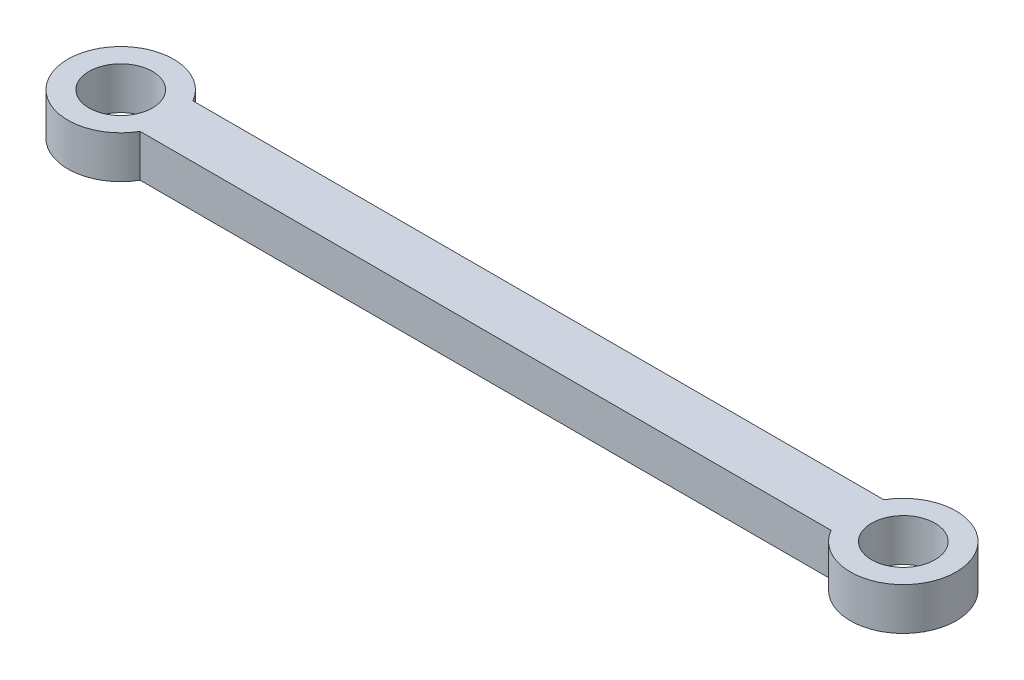
ISO-10303-21;
HEADER;
FILE_DESCRIPTION(('STEP AP214'),'2;1');
FILE_NAME('part.step','',(''),(''),'','','');
FILE_SCHEMA(('AUTOMOTIVE_DESIGN { 1 0 10303 214 1 1 1 1 }'));
ENDSEC;
DATA;
#1=APPLICATION_CONTEXT('core data for automotive mechanical design processes');
#2=APPLICATION_PROTOCOL_DEFINITION('international standard','automotive_design',2000,#1);
#3=PRODUCT_CONTEXT('',#1,'mechanical');
#4=PRODUCT('Part','Part','',(#3));
#5=PRODUCT_RELATED_PRODUCT_CATEGORY('part','',(#4));
#6=PRODUCT_DEFINITION_FORMATION('','',#4);
#7=PRODUCT_DEFINITION_CONTEXT('part definition',#1,'design');
#8=PRODUCT_DEFINITION('design','',#6,#7);
#9=PRODUCT_DEFINITION_SHAPE('','',#8);
#10=(LENGTH_UNIT() NAMED_UNIT(*) SI_UNIT(.MILLI.,.METRE.));
#11=(NAMED_UNIT(*) PLANE_ANGLE_UNIT() SI_UNIT($,.RADIAN.));
#12=(NAMED_UNIT(*) SI_UNIT($,.STERADIAN.) SOLID_ANGLE_UNIT());
#13=UNCERTAINTY_MEASURE_WITH_UNIT(LENGTH_MEASURE(1.E-05),#10,'distance_accuracy_value','');
#14=(GEOMETRIC_REPRESENTATION_CONTEXT(3) GLOBAL_UNCERTAINTY_ASSIGNED_CONTEXT((#13)) GLOBAL_UNIT_ASSIGNED_CONTEXT((#10,
#11,#12)) REPRESENTATION_CONTEXT('',''));
#15=CARTESIAN_POINT('',(0.,0.,0.));
#16=DIRECTION('',(0.,0.,1.));
#17=DIRECTION('',(1.,0.,0.));
#18=AXIS2_PLACEMENT_3D('',#15,#16,#17);
#19=CARTESIAN_POINT('',(-11.7883246029072,2.,-8.43272302998485));
#20=DIRECTION('',(0.,1.,0.));
#21=DIRECTION('',(0.,0.,1.));
#22=AXIS2_PLACEMENT_3D('',#19,#20,#21);
#23=PLANE('',#22);
#24=CARTESIAN_POINT('',(25.2116753970928,2.,-8.43272302998485));
#25=DIRECTION('',(0.,1.,0.));
#26=DIRECTION('',(0.,0.,1.));
#27=AXIS2_PLACEMENT_3D('',#24,#25,#26);
#28=CIRCLE('',#27,1.5);
#29=CARTESIAN_POINT('',(25.2116753970928,2.,-6.93272302998485));
#30=VERTEX_POINT('',#29);
#31=EDGE_CURVE('E103',#30,#30,#28,.T.);
#32=ORIENTED_EDGE('',*,*,#31,.F.);
#33=EDGE_LOOP('',(#32));
#34=FACE_BOUND('',#33,.T.);
#35=CARTESIAN_POINT('',(-11.7883246029072,2.,-8.43272302998485));
#36=DIRECTION('',(0.,1.,0.));
#37=DIRECTION('',(0.,0.,1.));
#38=AXIS2_PLACEMENT_3D('',#35,#36,#37);
#39=CIRCLE('',#38,2.5);
#40=CARTESIAN_POINT('',(-9.62326109344615,2.,-9.68272302998485));
#41=VERTEX_POINT('',#40);
#42=CARTESIAN_POINT('',(-9.62326109344615,2.,-7.18272302998485));
#43=VERTEX_POINT('',#42);
#44=EDGE_CURVE('E88',#41,#43,#39,.T.);
#45=ORIENTED_EDGE('',*,*,#44,.T.);
#46=DIRECTION('',(1.,0.,0.));
#47=VECTOR('',#46,1.);
#48=CARTESIAN_POINT('',(-9.62326109344615,2.,-7.18272302998485));
#49=LINE('',#48,#47);
#50=CARTESIAN_POINT('',(23.0466118876317,2.,-7.18272302998485));
#51=VERTEX_POINT('',#50);
#52=EDGE_CURVE('E83',#43,#51,#49,.T.);
#53=ORIENTED_EDGE('',*,*,#52,.T.);
#54=CARTESIAN_POINT('',(25.2116753970928,2.,-8.43272302998485));
#55=DIRECTION('',(0.,1.,0.));
#56=DIRECTION('',(0.,0.,1.));
#57=AXIS2_PLACEMENT_3D('',#54,#55,#56);
#58=CIRCLE('',#57,2.5);
#59=CARTESIAN_POINT('',(23.0466118876317,2.,-9.68272302998485));
#60=VERTEX_POINT('',#59);
#61=EDGE_CURVE('E86',#51,#60,#58,.T.);
#62=ORIENTED_EDGE('',*,*,#61,.T.);
#63=DIRECTION('',(-1.,0.,0.));
#64=VECTOR('',#63,1.);
#65=CARTESIAN_POINT('',(-9.62326109344615,2.,-9.68272302998485));
#66=LINE('',#65,#64);
#67=EDGE_CURVE('E53',#60,#41,#66,.T.);
#68=ORIENTED_EDGE('',*,*,#67,.T.);
#69=EDGE_LOOP('',(#45,#53,#62,#68));
#70=FACE_BOUND('',#69,.T.);
#71=CARTESIAN_POINT('',(-11.7883246029072,2.,-8.43272302998485));
#72=DIRECTION('',(0.,1.,0.));
#73=DIRECTION('',(0.,0.,1.));
#74=AXIS2_PLACEMENT_3D('',#71,#72,#73);
#75=CIRCLE('',#74,1.5);
#76=CARTESIAN_POINT('',(-11.7883246029072,2.,-6.93272302998485));
#77=VERTEX_POINT('',#76);
#78=EDGE_CURVE('E118',#77,#77,#75,.T.);
#79=ORIENTED_EDGE('',*,*,#78,.F.);
#80=EDGE_LOOP('',(#79));
#81=FACE_BOUND('',#80,.T.);
#82=ADVANCED_FACE('F36',(#34,#70,#81),#23,.T.);
#83=CARTESIAN_POINT('',(-11.7883246029072,0.,-8.43272302998485));
#84=DIRECTION('',(0.,1.,0.));
#85=DIRECTION('',(0.,0.,1.));
#86=AXIS2_PLACEMENT_3D('',#83,#84,#85);
#87=PLANE('',#86);
#88=CARTESIAN_POINT('',(-11.7883246029072,0.,-8.43272302998485));
#89=DIRECTION('',(0.,1.,0.));
#90=DIRECTION('',(0.,0.,1.));
#91=AXIS2_PLACEMENT_3D('',#88,#89,#90);
#92=CIRCLE('',#91,2.5);
#93=CARTESIAN_POINT('',(-9.62326109344615,0.,-9.68272302998485));
#94=VERTEX_POINT('',#93);
#95=CARTESIAN_POINT('',(-9.62326109344615,0.,-7.18272302998485));
#96=VERTEX_POINT('',#95);
#97=EDGE_CURVE('E100',#94,#96,#92,.T.);
#98=ORIENTED_EDGE('',*,*,#97,.F.);
#99=DIRECTION('',(-1.,0.,0.));
#100=VECTOR('',#99,1.);
#101=CARTESIAN_POINT('',(-9.62326109344615,0.,-9.68272302998485));
#102=LINE('',#101,#100);
#103=CARTESIAN_POINT('',(23.0466118876317,0.,-9.68272302998485));
#104=VERTEX_POINT('',#103);
#105=EDGE_CURVE('E76',#104,#94,#102,.T.);
#106=ORIENTED_EDGE('',*,*,#105,.F.);
#107=CARTESIAN_POINT('',(25.2116753970928,0.,-8.43272302998485));
#108=DIRECTION('',(0.,1.,0.));
#109=DIRECTION('',(0.,0.,1.));
#110=AXIS2_PLACEMENT_3D('',#107,#108,#109);
#111=CIRCLE('',#110,2.5);
#112=CARTESIAN_POINT('',(23.0466118876317,0.,-7.18272302998485));
#113=VERTEX_POINT('',#112);
#114=EDGE_CURVE('E70',#113,#104,#111,.T.);
#115=ORIENTED_EDGE('',*,*,#114,.F.);
#116=DIRECTION('',(1.,0.,0.));
#117=VECTOR('',#116,1.);
#118=CARTESIAN_POINT('',(-9.62326109344615,0.,-7.18272302998485));
#119=LINE('',#118,#117);
#120=EDGE_CURVE('E92',#96,#113,#119,.T.);
#121=ORIENTED_EDGE('',*,*,#120,.F.);
#122=EDGE_LOOP('',(#98,#106,#115,#121));
#123=FACE_BOUND('',#122,.T.);
#124=CARTESIAN_POINT('',(25.2116753970928,0.,-8.43272302998485));
#125=DIRECTION('',(0.,1.,0.));
#126=DIRECTION('',(0.,0.,1.));
#127=AXIS2_PLACEMENT_3D('',#124,#125,#126);
#128=CIRCLE('',#127,1.5);
#129=CARTESIAN_POINT('',(25.2116753970928,0.,-6.93272302998485));
#130=VERTEX_POINT('',#129);
#131=EDGE_CURVE('E115',#130,#130,#128,.T.);
#132=ORIENTED_EDGE('',*,*,#131,.T.);
#133=EDGE_LOOP('',(#132));
#134=FACE_BOUND('',#133,.T.);
#135=CARTESIAN_POINT('',(-11.7883246029072,0.,-8.43272302998485));
#136=DIRECTION('',(0.,1.,0.));
#137=DIRECTION('',(0.,0.,1.));
#138=AXIS2_PLACEMENT_3D('',#135,#136,#137);
#139=CIRCLE('',#138,1.5);
#140=CARTESIAN_POINT('',(-11.7883246029072,0.,-6.93272302998485));
#141=VERTEX_POINT('',#140);
#142=EDGE_CURVE('E121',#141,#141,#139,.T.);
#143=ORIENTED_EDGE('',*,*,#142,.T.);
#144=EDGE_LOOP('',(#143));
#145=FACE_BOUND('',#144,.T.);
#146=ADVANCED_FACE('F111',(#123,#134,#145),#87,.F.);
#147=CARTESIAN_POINT('',(-11.7883246029072,2.,-8.43272302998485));
#148=DIRECTION('',(0.,-1.,0.));
#149=DIRECTION('',(0.,0.,-1.));
#150=AXIS2_PLACEMENT_3D('',#147,#148,#149);
#151=CYLINDRICAL_SURFACE('',#150,2.5);
#152=ORIENTED_EDGE('',*,*,#97,.T.);
#153=DIRECTION('',(0.,-1.,0.));
#154=VECTOR('',#153,1.);
#155=CARTESIAN_POINT('',(-9.62326109344615,2.,-7.18272302998485));
#156=LINE('',#155,#154);
#157=EDGE_CURVE('E11',#43,#96,#156,.T.);
#158=ORIENTED_EDGE('',*,*,#157,.F.);
#159=ORIENTED_EDGE('',*,*,#44,.F.);
#160=DIRECTION('',(0.,-1.,0.));
#161=VECTOR('',#160,1.);
#162=CARTESIAN_POINT('',(-9.62326109344615,2.,-9.68272302998485));
#163=LINE('',#162,#161);
#164=EDGE_CURVE('E96',#41,#94,#163,.T.);
#165=ORIENTED_EDGE('',*,*,#164,.T.);
#166=EDGE_LOOP('',(#152,#158,#159,#165));
#167=FACE_BOUND('',#166,.T.);
#168=ADVANCED_FACE('F38',(#167),#151,.T.);
#169=CARTESIAN_POINT('',(-9.62326109344615,2.,-7.18272302998485));
#170=DIRECTION('',(0.,0.,-1.));
#171=DIRECTION('',(-1.,0.,0.));
#172=AXIS2_PLACEMENT_3D('',#169,#170,#171);
#173=PLANE('',#172);
#174=ORIENTED_EDGE('',*,*,#120,.T.);
#175=DIRECTION('',(0.,-1.,0.));
#176=VECTOR('',#175,1.);
#177=CARTESIAN_POINT('',(23.0466118876317,2.,-7.18272302998485));
#178=LINE('',#177,#176);
#179=EDGE_CURVE('E45',#51,#113,#178,.T.);
#180=ORIENTED_EDGE('',*,*,#179,.F.);
#181=ORIENTED_EDGE('',*,*,#52,.F.);
#182=ORIENTED_EDGE('',*,*,#157,.T.);
#183=EDGE_LOOP('',(#174,#180,#181,#182));
#184=FACE_BOUND('',#183,.T.);
#185=ADVANCED_FACE('F91',(#184),#173,.F.);
#186=CARTESIAN_POINT('',(25.2116753970928,2.,-8.43272302998485));
#187=DIRECTION('',(0.,-1.,0.));
#188=DIRECTION('',(0.,0.,-1.));
#189=AXIS2_PLACEMENT_3D('',#186,#187,#188);
#190=CYLINDRICAL_SURFACE('',#189,2.5);
#191=ORIENTED_EDGE('',*,*,#114,.T.);
#192=DIRECTION('',(0.,-1.,0.));
#193=VECTOR('',#192,1.);
#194=CARTESIAN_POINT('',(23.0466118876317,2.,-9.68272302998485));
#195=LINE('',#194,#193);
#196=EDGE_CURVE('E93',#60,#104,#195,.T.);
#197=ORIENTED_EDGE('',*,*,#196,.F.);
#198=ORIENTED_EDGE('',*,*,#61,.F.);
#199=ORIENTED_EDGE('',*,*,#179,.T.);
#200=EDGE_LOOP('',(#191,#197,#198,#199));
#201=FACE_BOUND('',#200,.T.);
#202=ADVANCED_FACE('F94',(#201),#190,.T.);
#203=CARTESIAN_POINT('',(-9.62326109344615,2.,-9.68272302998485));
#204=DIRECTION('',(0.,0.,1.));
#205=DIRECTION('',(1.,0.,0.));
#206=AXIS2_PLACEMENT_3D('',#203,#204,#205);
#207=PLANE('',#206);
#208=ORIENTED_EDGE('',*,*,#105,.T.);
#209=ORIENTED_EDGE('',*,*,#164,.F.);
#210=ORIENTED_EDGE('',*,*,#67,.F.);
#211=ORIENTED_EDGE('',*,*,#196,.T.);
#212=EDGE_LOOP('',(#208,#209,#210,#211));
#213=FACE_BOUND('',#212,.T.);
#214=ADVANCED_FACE('F108',(#213),#207,.F.);
#215=CARTESIAN_POINT('',(25.2116753970928,2.,-8.43272302998485));
#216=DIRECTION('',(0.,-1.,0.));
#217=DIRECTION('',(0.,0.,-1.));
#218=AXIS2_PLACEMENT_3D('',#215,#216,#217);
#219=CYLINDRICAL_SURFACE('',#218,1.5);
#220=ORIENTED_EDGE('',*,*,#31,.T.);
#221=EDGE_LOOP('',(#220));
#222=FACE_BOUND('',#221,.T.);
#223=ORIENTED_EDGE('',*,*,#131,.F.);
#224=EDGE_LOOP('',(#223));
#225=FACE_BOUND('',#224,.T.);
#226=ADVANCED_FACE('F138',(#222,#225),#219,.F.);
#227=CARTESIAN_POINT('',(-11.7883246029072,2.,-8.43272302998485));
#228=DIRECTION('',(0.,-1.,0.));
#229=DIRECTION('',(0.,0.,-1.));
#230=AXIS2_PLACEMENT_3D('',#227,#228,#229);
#231=CYLINDRICAL_SURFACE('',#230,1.5);
#232=ORIENTED_EDGE('',*,*,#78,.T.);
#233=EDGE_LOOP('',(#232));
#234=FACE_BOUND('',#233,.T.);
#235=ORIENTED_EDGE('',*,*,#142,.F.);
#236=EDGE_LOOP('',(#235));
#237=FACE_BOUND('',#236,.T.);
#238=ADVANCED_FACE('F127',(#234,#237),#231,.F.);
#239=CLOSED_SHELL('',(#82,#146,#168,#185,#202,#214,#226,#238));
#240=MANIFOLD_SOLID_BREP('B2',#239);
#241=ADVANCED_BREP_SHAPE_REPRESENTATION('',(#18,#240),#14);
#242=SHAPE_DEFINITION_REPRESENTATION(#9,#241);
ENDSEC;
END-ISO-10303-21;
